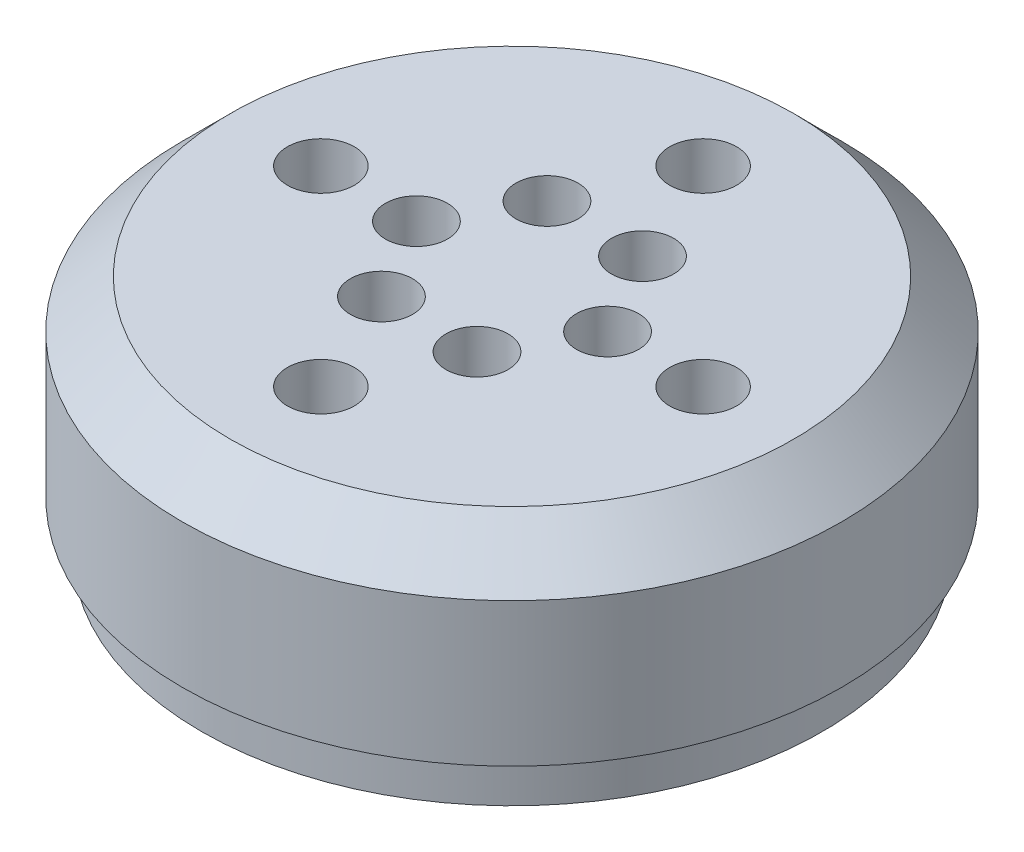
ISO-10303-21;
HEADER;
FILE_DESCRIPTION(('STEP AP214'),'2;1');
FILE_NAME('part.step','',(''),(''),'','','');
FILE_SCHEMA(('AUTOMOTIVE_DESIGN { 1 0 10303 214 1 1 1 1 }'));
ENDSEC;
DATA;
#1=APPLICATION_CONTEXT('core data for automotive mechanical design processes');
#2=APPLICATION_PROTOCOL_DEFINITION('international standard','automotive_design',2000,#1);
#3=PRODUCT_CONTEXT('',#1,'mechanical');
#4=PRODUCT('Part','Part','',(#3));
#5=PRODUCT_RELATED_PRODUCT_CATEGORY('part','',(#4));
#6=PRODUCT_DEFINITION_FORMATION('','',#4);
#7=PRODUCT_DEFINITION_CONTEXT('part definition',#1,'design');
#8=PRODUCT_DEFINITION('design','',#6,#7);
#9=PRODUCT_DEFINITION_SHAPE('','',#8);
#10=(LENGTH_UNIT() NAMED_UNIT(*) SI_UNIT(.MILLI.,.METRE.));
#11=(NAMED_UNIT(*) PLANE_ANGLE_UNIT() SI_UNIT($,.RADIAN.));
#12=(NAMED_UNIT(*) SI_UNIT($,.STERADIAN.) SOLID_ANGLE_UNIT());
#13=UNCERTAINTY_MEASURE_WITH_UNIT(LENGTH_MEASURE(1.E-05),#10,'distance_accuracy_value','');
#14=(GEOMETRIC_REPRESENTATION_CONTEXT(3) GLOBAL_UNCERTAINTY_ASSIGNED_CONTEXT((#13)) GLOBAL_UNIT_ASSIGNED_CONTEXT((#10,
#11,#12)) REPRESENTATION_CONTEXT('',''));
#15=CARTESIAN_POINT('',(0.,0.,0.));
#16=DIRECTION('',(0.,0.,1.));
#17=DIRECTION('',(1.,0.,0.));
#18=AXIS2_PLACEMENT_3D('',#15,#16,#17);
#19=CARTESIAN_POINT('',(-4.99999999999981,11.5,-8.66025403784503));
#20=DIRECTION('',(0.,-1.,0.));
#21=DIRECTION('',(0.,0.,-1.));
#22=AXIS2_PLACEMENT_3D('',#19,#20,#21);
#23=CYLINDRICAL_SURFACE('',#22,1.24999999999972);
#24=CARTESIAN_POINT('',(-4.99999999999981,0.,-8.66025403784503));
#25=DIRECTION('',(0.,1.,0.));
#26=DIRECTION('',(0.,0.,1.));
#27=AXIS2_PLACEMENT_3D('',#24,#25,#26);
#28=CIRCLE('',#27,1.24999999999972);
#29=CARTESIAN_POINT('',(-4.99999999999981,0.,-7.41025403784531));
#30=VERTEX_POINT('',#29);
#31=EDGE_CURVE('E102',#30,#30,#28,.T.);
#32=ORIENTED_EDGE('',*,*,#31,.F.);
#33=EDGE_LOOP('',(#32));
#34=FACE_BOUND('',#33,.T.);
#35=CARTESIAN_POINT('',(-4.99999999999981,4.,-8.66025403784503));
#36=DIRECTION('',(0.,1.,0.));
#37=DIRECTION('',(0.,0.,1.));
#38=AXIS2_PLACEMENT_3D('',#35,#36,#37);
#39=CIRCLE('',#38,1.24999999999972);
#40=CARTESIAN_POINT('',(-4.99999999999981,4.,-7.41025403784531));
#41=VERTEX_POINT('',#40);
#42=EDGE_CURVE('E69',#41,#41,#39,.T.);
#43=ORIENTED_EDGE('',*,*,#42,.T.);
#44=EDGE_LOOP('',(#43));
#45=FACE_BOUND('',#44,.T.);
#46=ADVANCED_FACE('F47',(#34,#45),#23,.F.);
#47=CARTESIAN_POINT('',(-9.99999999999999,11.5,-2.00360561475321E-13));
#48=DIRECTION('',(0.,-1.,0.));
#49=DIRECTION('',(0.,0.,-1.));
#50=AXIS2_PLACEMENT_3D('',#47,#48,#49);
#51=CYLINDRICAL_SURFACE('',#50,1.25);
#52=CARTESIAN_POINT('',(-9.99999999999999,0.,-2.00360561475321E-13));
#53=DIRECTION('',(0.,1.,0.));
#54=DIRECTION('',(0.,0.,1.));
#55=AXIS2_PLACEMENT_3D('',#52,#53,#54);
#56=CIRCLE('',#55,1.25);
#57=CARTESIAN_POINT('',(-9.99999999999999,0.,1.2499999999998));
#58=VERTEX_POINT('',#57);
#59=EDGE_CURVE('E73',#58,#58,#56,.T.);
#60=ORIENTED_EDGE('',*,*,#59,.F.);
#61=EDGE_LOOP('',(#60));
#62=FACE_BOUND('',#61,.T.);
#63=CARTESIAN_POINT('',(-9.99999999999999,4.,-2.00360561475321E-13));
#64=DIRECTION('',(0.,1.,0.));
#65=DIRECTION('',(0.,0.,1.));
#66=AXIS2_PLACEMENT_3D('',#63,#64,#65);
#67=CIRCLE('',#66,1.25);
#68=CARTESIAN_POINT('',(-9.99999999999999,4.,1.2499999999998));
#69=VERTEX_POINT('',#68);
#70=EDGE_CURVE('E74',#69,#69,#67,.T.);
#71=ORIENTED_EDGE('',*,*,#70,.T.);
#72=EDGE_LOOP('',(#71));
#73=FACE_BOUND('',#72,.T.);
#74=ADVANCED_FACE('F257',(#62,#73),#51,.F.);
#75=CARTESIAN_POINT('',(-4.99999999999968,11.5,8.66025403784456));
#76=DIRECTION('',(0.,-1.,0.));
#77=DIRECTION('',(0.,0.,-1.));
#78=AXIS2_PLACEMENT_3D('',#75,#76,#77);
#79=CYLINDRICAL_SURFACE('',#78,1.25000000000053);
#80=CARTESIAN_POINT('',(-4.99999999999968,0.,8.66025403784456));
#81=DIRECTION('',(0.,1.,0.));
#82=DIRECTION('',(0.,0.,1.));
#83=AXIS2_PLACEMENT_3D('',#80,#81,#82);
#84=CIRCLE('',#83,1.25000000000053);
#85=CARTESIAN_POINT('',(-4.99999999999968,0.,9.91025403784509));
#86=VERTEX_POINT('',#85);
#87=EDGE_CURVE('E123',#86,#86,#84,.T.);
#88=ORIENTED_EDGE('',*,*,#87,.F.);
#89=EDGE_LOOP('',(#88));
#90=FACE_BOUND('',#89,.T.);
#91=CARTESIAN_POINT('',(-4.99999999999968,4.,8.66025403784456));
#92=DIRECTION('',(0.,1.,0.));
#93=DIRECTION('',(0.,0.,1.));
#94=AXIS2_PLACEMENT_3D('',#91,#92,#93);
#95=CIRCLE('',#94,1.25000000000053);
#96=CARTESIAN_POINT('',(-4.99999999999968,4.,9.91025403784509));
#97=VERTEX_POINT('',#96);
#98=EDGE_CURVE('E78',#97,#97,#95,.T.);
#99=ORIENTED_EDGE('',*,*,#98,.T.);
#100=EDGE_LOOP('',(#99));
#101=FACE_BOUND('',#100,.T.);
#102=ADVANCED_FACE('F264',(#90,#101),#79,.F.);
#103=CARTESIAN_POINT('',(5.00000000000066,11.5,-8.6602540378451));
#104=DIRECTION('',(0.,-1.,0.));
#105=DIRECTION('',(0.,0.,-1.));
#106=AXIS2_PLACEMENT_3D('',#103,#104,#105);
#107=CYLINDRICAL_SURFACE('',#106,1.25000000000011);
#108=CARTESIAN_POINT('',(5.00000000000066,0.,-8.6602540378451));
#109=DIRECTION('',(0.,1.,0.));
#110=DIRECTION('',(0.,0.,1.));
#111=AXIS2_PLACEMENT_3D('',#108,#109,#110);
#112=CIRCLE('',#111,1.25000000000011);
#113=CARTESIAN_POINT('',(5.00000000000066,0.,-7.41025403784499));
#114=VERTEX_POINT('',#113);
#115=EDGE_CURVE('E107',#114,#114,#112,.T.);
#116=ORIENTED_EDGE('',*,*,#115,.F.);
#117=EDGE_LOOP('',(#116));
#118=FACE_BOUND('',#117,.T.);
#119=CARTESIAN_POINT('',(5.00000000000066,4.,-8.6602540378451));
#120=DIRECTION('',(0.,1.,0.));
#121=DIRECTION('',(0.,0.,1.));
#122=AXIS2_PLACEMENT_3D('',#119,#120,#121);
#123=CIRCLE('',#122,1.25000000000011);
#124=CARTESIAN_POINT('',(5.00000000000066,4.,-7.41025403784499));
#125=VERTEX_POINT('',#124);
#126=EDGE_CURVE('E82',#125,#125,#123,.T.);
#127=ORIENTED_EDGE('',*,*,#126,.T.);
#128=EDGE_LOOP('',(#127));
#129=FACE_BOUND('',#128,.T.);
#130=ADVANCED_FACE('F270',(#118,#129),#107,.F.);
#131=CARTESIAN_POINT('',(10.000000000001,11.5,-3.44968021723089E-13));
#132=DIRECTION('',(0.,-1.,0.));
#133=DIRECTION('',(0.,0.,-1.));
#134=AXIS2_PLACEMENT_3D('',#131,#132,#133);
#135=CYLINDRICAL_SURFACE('',#134,1.25000000000068);
#136=CARTESIAN_POINT('',(10.000000000001,0.,-3.44968021723089E-13));
#137=DIRECTION('',(0.,1.,0.));
#138=DIRECTION('',(0.,0.,1.));
#139=AXIS2_PLACEMENT_3D('',#136,#137,#138);
#140=CIRCLE('',#139,1.25000000000068);
#141=CARTESIAN_POINT('',(10.000000000001,0.,1.25000000000034));
#142=VERTEX_POINT('',#141);
#143=EDGE_CURVE('E112',#142,#142,#140,.T.);
#144=ORIENTED_EDGE('',*,*,#143,.F.);
#145=EDGE_LOOP('',(#144));
#146=FACE_BOUND('',#145,.T.);
#147=CARTESIAN_POINT('',(10.000000000001,4.,-3.44968021723089E-13));
#148=DIRECTION('',(0.,1.,0.));
#149=DIRECTION('',(0.,0.,1.));
#150=AXIS2_PLACEMENT_3D('',#147,#148,#149);
#151=CIRCLE('',#150,1.25000000000068);
#152=CARTESIAN_POINT('',(10.000000000001,4.,1.25000000000034));
#153=VERTEX_POINT('',#152);
#154=EDGE_CURVE('E86',#153,#153,#151,.T.);
#155=ORIENTED_EDGE('',*,*,#154,.T.);
#156=EDGE_LOOP('',(#155));
#157=FACE_BOUND('',#156,.T.);
#158=ADVANCED_FACE('F289',(#146,#157),#135,.F.);
#159=CARTESIAN_POINT('',(5.00000000000078,11.5,8.66025403784449));
#160=DIRECTION('',(0.,-1.,0.));
#161=DIRECTION('',(0.,0.,-1.));
#162=AXIS2_PLACEMENT_3D('',#159,#160,#161);
#163=CYLINDRICAL_SURFACE('',#162,1.25000000000087);
#164=CARTESIAN_POINT('',(5.00000000000078,0.,8.66025403784449));
#165=DIRECTION('',(0.,1.,0.));
#166=DIRECTION('',(0.,0.,1.));
#167=AXIS2_PLACEMENT_3D('',#164,#165,#166);
#168=CIRCLE('',#167,1.25000000000087);
#169=CARTESIAN_POINT('',(5.00000000000078,0.,9.91025403784536));
#170=VERTEX_POINT('',#169);
#171=EDGE_CURVE('E119',#170,#170,#168,.T.);
#172=ORIENTED_EDGE('',*,*,#171,.F.);
#173=EDGE_LOOP('',(#172));
#174=FACE_BOUND('',#173,.T.);
#175=CARTESIAN_POINT('',(5.00000000000078,4.,8.66025403784449));
#176=DIRECTION('',(0.,1.,0.));
#177=DIRECTION('',(0.,0.,1.));
#178=AXIS2_PLACEMENT_3D('',#175,#176,#177);
#179=CIRCLE('',#178,1.25000000000087);
#180=CARTESIAN_POINT('',(5.00000000000078,4.,9.91025403784536));
#181=VERTEX_POINT('',#180);
#182=EDGE_CURVE('E90',#181,#181,#179,.T.);
#183=ORIENTED_EDGE('',*,*,#182,.T.);
#184=EDGE_LOOP('',(#183));
#185=FACE_BOUND('',#184,.T.);
#186=ADVANCED_FACE('F284',(#174,#185),#163,.F.);
#187=CARTESIAN_POINT('',(0.,5.,0.));
#188=DIRECTION('',(0.,-1.,0.));
#189=DIRECTION('',(0.,0.,-1.));
#190=AXIS2_PLACEMENT_3D('',#187,#188,#189);
#191=CYLINDRICAL_SURFACE('',#190,32.5);
#192=CARTESIAN_POINT('',(0.,5.,0.));
#193=DIRECTION('',(0.,1.,0.));
#194=DIRECTION('',(0.,0.,1.));
#195=AXIS2_PLACEMENT_3D('',#192,#193,#194);
#196=CIRCLE('',#195,32.5);
#197=CARTESIAN_POINT('',(0.,5.,32.5));
#198=VERTEX_POINT('',#197);
#199=EDGE_CURVE('E61',#198,#198,#196,.T.);
#200=ORIENTED_EDGE('',*,*,#199,.F.);
#201=EDGE_LOOP('',(#200));
#202=FACE_BOUND('',#201,.T.);
#203=CARTESIAN_POINT('',(0.,0.,0.));
#204=DIRECTION('',(0.,1.,0.));
#205=DIRECTION('',(0.,0.,1.));
#206=AXIS2_PLACEMENT_3D('',#203,#204,#205);
#207=CIRCLE('',#206,32.5);
#208=CARTESIAN_POINT('',(0.,0.,32.5));
#209=VERTEX_POINT('',#208);
#210=EDGE_CURVE('E66',#209,#209,#207,.T.);
#211=ORIENTED_EDGE('',*,*,#210,.T.);
#212=EDGE_LOOP('',(#211));
#213=FACE_BOUND('',#212,.T.);
#214=ADVANCED_FACE('F281',(#202,#213),#191,.T.);
#215=CARTESIAN_POINT('',(0.,0.,0.));
#216=DIRECTION('',(0.,1.,0.));
#217=DIRECTION('',(0.,0.,1.));
#218=AXIS2_PLACEMENT_3D('',#215,#216,#217);
#219=PLANE('',#218);
#220=ORIENTED_EDGE('',*,*,#171,.T.);
#221=EDGE_LOOP('',(#220));
#222=FACE_BOUND('',#221,.T.);
#223=ORIENTED_EDGE('',*,*,#143,.T.);
#224=EDGE_LOOP('',(#223));
#225=FACE_BOUND('',#224,.T.);
#226=ORIENTED_EDGE('',*,*,#115,.T.);
#227=EDGE_LOOP('',(#226));
#228=FACE_BOUND('',#227,.T.);
#229=CARTESIAN_POINT('',(0.,0.,0.));
#230=DIRECTION('',(0.,1.,0.));
#231=DIRECTION('',(0.,0.,1.));
#232=AXIS2_PLACEMENT_3D('',#229,#230,#231);
#233=CIRCLE('',#232,4.);
#234=CARTESIAN_POINT('',(0.,0.,4.));
#235=VERTEX_POINT('',#234);
#236=EDGE_CURVE('E106',#235,#235,#233,.T.);
#237=ORIENTED_EDGE('',*,*,#236,.T.);
#238=EDGE_LOOP('',(#237));
#239=FACE_BOUND('',#238,.T.);
#240=ORIENTED_EDGE('',*,*,#87,.T.);
#241=EDGE_LOOP('',(#240));
#242=FACE_BOUND('',#241,.T.);
#243=ORIENTED_EDGE('',*,*,#59,.T.);
#244=EDGE_LOOP('',(#243));
#245=FACE_BOUND('',#244,.T.);
#246=ORIENTED_EDGE('',*,*,#31,.T.);
#247=EDGE_LOOP('',(#246));
#248=FACE_BOUND('',#247,.T.);
#249=ORIENTED_EDGE('',*,*,#210,.F.);
#250=EDGE_LOOP('',(#249));
#251=FACE_BOUND('',#250,.T.);
#252=ADVANCED_FACE('F279',(#222,#225,#228,#239,#242,#245,#248,#251),#219,.F.);
#253=CARTESIAN_POINT('',(0.,25.,0.));
#254=DIRECTION('',(0.,-1.,0.));
#255=DIRECTION('',(0.,0.,-1.));
#256=AXIS2_PLACEMENT_3D('',#253,#254,#255);
#257=CYLINDRICAL_SURFACE('',#256,34.5);
#258=CARTESIAN_POINT('',(0.,20.,0.));
#259=DIRECTION('',(0.,1.,0.));
#260=DIRECTION('',(0.,0.,1.));
#261=AXIS2_PLACEMENT_3D('',#258,#259,#260);
#262=CIRCLE('',#261,34.5);
#263=CARTESIAN_POINT('',(0.,20.,34.5));
#264=VERTEX_POINT('',#263);
#265=EDGE_CURVE('E11',#264,#264,#262,.F.);
#266=ORIENTED_EDGE('',*,*,#265,.T.);
#267=EDGE_LOOP('',(#266));
#268=FACE_BOUND('',#267,.T.);
#269=CARTESIAN_POINT('',(0.,5.,0.));
#270=DIRECTION('',(0.,1.,0.));
#271=DIRECTION('',(0.,0.,1.));
#272=AXIS2_PLACEMENT_3D('',#269,#270,#271);
#273=CIRCLE('',#272,34.5);
#274=CARTESIAN_POINT('',(0.,5.,34.5));
#275=VERTEX_POINT('',#274);
#276=EDGE_CURVE('E97',#275,#275,#273,.T.);
#277=ORIENTED_EDGE('',*,*,#276,.T.);
#278=EDGE_LOOP('',(#277));
#279=FACE_BOUND('',#278,.T.);
#280=ADVANCED_FACE('F219',(#268,#279),#257,.T.);
#281=CARTESIAN_POINT('',(0.,25.,0.));
#282=DIRECTION('',(0.,1.,0.));
#283=DIRECTION('',(0.,0.,1.));
#284=AXIS2_PLACEMENT_3D('',#281,#282,#283);
#285=PLANE('',#284);
#286=CARTESIAN_POINT('',(0.,25.,0.));
#287=DIRECTION('',(0.,1.,0.));
#288=DIRECTION('',(0.,0.,1.));
#289=AXIS2_PLACEMENT_3D('',#286,#287,#288);
#290=CIRCLE('',#289,29.5);
#291=CARTESIAN_POINT('',(0.,25.,29.5));
#292=VERTEX_POINT('',#291);
#293=EDGE_CURVE('E56',#292,#292,#290,.T.);
#294=ORIENTED_EDGE('',*,*,#293,.T.);
#295=EDGE_LOOP('',(#294));
#296=FACE_BOUND('',#295,.T.);
#297=CARTESIAN_POINT('',(0.,25.,-20.));
#298=DIRECTION('',(0.,1.,0.));
#299=DIRECTION('',(0.,0.,1.));
#300=AXIS2_PLACEMENT_3D('',#297,#298,#299);
#301=CIRCLE('',#300,3.5);
#302=CARTESIAN_POINT('',(0.,25.,-16.5));
#303=VERTEX_POINT('',#302);
#304=EDGE_CURVE('E202',#303,#303,#301,.T.);
#305=ORIENTED_EDGE('',*,*,#304,.F.);
#306=EDGE_LOOP('',(#305));
#307=FACE_BOUND('',#306,.T.);
#308=CARTESIAN_POINT('',(20.,25.,0.));
#309=DIRECTION('',(0.,1.,0.));
#310=DIRECTION('',(0.,0.,1.));
#311=AXIS2_PLACEMENT_3D('',#308,#309,#310);
#312=CIRCLE('',#311,3.5);
#313=CARTESIAN_POINT('',(20.,25.,3.5));
#314=VERTEX_POINT('',#313);
#315=EDGE_CURVE('E198',#314,#314,#312,.T.);
#316=ORIENTED_EDGE('',*,*,#315,.F.);
#317=EDGE_LOOP('',(#316));
#318=FACE_BOUND('',#317,.T.);
#319=CARTESIAN_POINT('',(0.,25.,20.));
#320=DIRECTION('',(0.,1.,0.));
#321=DIRECTION('',(0.,0.,1.));
#322=AXIS2_PLACEMENT_3D('',#319,#320,#321);
#323=CIRCLE('',#322,3.5);
#324=CARTESIAN_POINT('',(0.,25.,23.5));
#325=VERTEX_POINT('',#324);
#326=EDGE_CURVE('E190',#325,#325,#323,.T.);
#327=ORIENTED_EDGE('',*,*,#326,.F.);
#328=EDGE_LOOP('',(#327));
#329=FACE_BOUND('',#328,.T.);
#330=CARTESIAN_POINT('',(-20.,25.,0.));
#331=DIRECTION('',(0.,1.,0.));
#332=DIRECTION('',(0.,0.,1.));
#333=AXIS2_PLACEMENT_3D('',#330,#331,#332);
#334=CIRCLE('',#333,3.5);
#335=CARTESIAN_POINT('',(-20.,25.,3.5));
#336=VERTEX_POINT('',#335);
#337=EDGE_CURVE('E181',#336,#336,#334,.T.);
#338=ORIENTED_EDGE('',*,*,#337,.F.);
#339=EDGE_LOOP('',(#338));
#340=FACE_BOUND('',#339,.T.);
#341=CARTESIAN_POINT('',(5.00000000000066,25.,-8.6602540378451));
#342=DIRECTION('',(0.,1.,0.));
#343=DIRECTION('',(0.,0.,1.));
#344=AXIS2_PLACEMENT_3D('',#341,#342,#343);
#345=CIRCLE('',#344,3.25);
#346=CARTESIAN_POINT('',(5.00000000000066,25.,-5.4102540378451));
#347=VERTEX_POINT('',#346);
#348=EDGE_CURVE('E140',#347,#347,#345,.T.);
#349=ORIENTED_EDGE('',*,*,#348,.F.);
#350=EDGE_LOOP('',(#349));
#351=FACE_BOUND('',#350,.T.);
#352=CARTESIAN_POINT('',(5.00000000000025,25.,8.66025403784534));
#353=DIRECTION('',(0.,1.,0.));
#354=DIRECTION('',(0.,0.,1.));
#355=AXIS2_PLACEMENT_3D('',#352,#353,#354);
#356=CIRCLE('',#355,3.25);
#357=CARTESIAN_POINT('',(5.00000000000025,25.,11.9102540378453));
#358=VERTEX_POINT('',#357);
#359=EDGE_CURVE('E159',#358,#358,#356,.T.);
#360=ORIENTED_EDGE('',*,*,#359,.F.);
#361=EDGE_LOOP('',(#360));
#362=FACE_BOUND('',#361,.T.);
#363=CARTESIAN_POINT('',(-5.00000000000072,25.,8.66025403784507));
#364=DIRECTION('',(0.,1.,0.));
#365=DIRECTION('',(0.,0.,1.));
#366=AXIS2_PLACEMENT_3D('',#363,#364,#365);
#367=CIRCLE('',#366,3.25);
#368=CARTESIAN_POINT('',(-5.00000000000072,25.,11.9102540378451));
#369=VERTEX_POINT('',#368);
#370=EDGE_CURVE('E151',#369,#369,#367,.T.);
#371=ORIENTED_EDGE('',*,*,#370,.F.);
#372=EDGE_LOOP('',(#371));
#373=FACE_BOUND('',#372,.T.);
#374=CARTESIAN_POINT('',(-10.0000000000009,25.,-3.03576608295941E-13));
#375=DIRECTION('',(0.,1.,0.));
#376=DIRECTION('',(0.,0.,1.));
#377=AXIS2_PLACEMENT_3D('',#374,#375,#376);
#378=CIRCLE('',#377,3.25);
#379=CARTESIAN_POINT('',(-10.0000000000009,25.,3.2499999999997));
#380=VERTEX_POINT('',#379);
#381=EDGE_CURVE('E141',#380,#380,#378,.T.);
#382=ORIENTED_EDGE('',*,*,#381,.F.);
#383=EDGE_LOOP('',(#382));
#384=FACE_BOUND('',#383,.T.);
#385=CARTESIAN_POINT('',(-5.00000000000019,25.,-8.66025403784537));
#386=DIRECTION('',(0.,1.,0.));
#387=DIRECTION('',(0.,0.,1.));
#388=AXIS2_PLACEMENT_3D('',#385,#386,#387);
#389=CIRCLE('',#388,3.25);
#390=CARTESIAN_POINT('',(-5.00000000000019,25.,-5.41025403784537));
#391=VERTEX_POINT('',#390);
#392=EDGE_CURVE('E150',#391,#391,#389,.T.);
#393=ORIENTED_EDGE('',*,*,#392,.F.);
#394=EDGE_LOOP('',(#393));
#395=FACE_BOUND('',#394,.T.);
#396=CARTESIAN_POINT('',(10.0000000000009,25.,2.34187669256869E-13));
#397=DIRECTION('',(0.,1.,0.));
#398=DIRECTION('',(0.,0.,1.));
#399=AXIS2_PLACEMENT_3D('',#396,#397,#398);
#400=CIRCLE('',#399,3.25);
#401=CARTESIAN_POINT('',(10.0000000000009,25.,3.25000000000023));
#402=VERTEX_POINT('',#401);
#403=EDGE_CURVE('E136',#402,#402,#400,.T.);
#404=ORIENTED_EDGE('',*,*,#403,.F.);
#405=EDGE_LOOP('',(#404));
#406=FACE_BOUND('',#405,.T.);
#407=ADVANCED_FACE('F215',(#296,#307,#318,#329,#340,#351,#362,#373,#384,#395,#406),#285,.T.);
#408=CARTESIAN_POINT('',(0.,5.,0.));
#409=DIRECTION('',(0.,1.,0.));
#410=DIRECTION('',(0.,0.,1.));
#411=AXIS2_PLACEMENT_3D('',#408,#409,#410);
#412=PLANE('',#411);
#413=ORIENTED_EDGE('',*,*,#199,.T.);
#414=EDGE_LOOP('',(#413));
#415=FACE_BOUND('',#414,.T.);
#416=ORIENTED_EDGE('',*,*,#276,.F.);
#417=EDGE_LOOP('',(#416));
#418=FACE_BOUND('',#417,.T.);
#419=ADVANCED_FACE('F218',(#415,#418),#412,.F.);
#420=CARTESIAN_POINT('',(0.,11.5,0.));
#421=DIRECTION('',(0.,-1.,0.));
#422=DIRECTION('',(0.,0.,-1.));
#423=AXIS2_PLACEMENT_3D('',#420,#421,#422);
#424=CYLINDRICAL_SURFACE('',#423,4.);
#425=CARTESIAN_POINT('',(0.,11.5,0.));
#426=DIRECTION('',(0.,1.,0.));
#427=DIRECTION('',(0.,0.,1.));
#428=AXIS2_PLACEMENT_3D('',#425,#426,#427);
#429=CIRCLE('',#428,4.);
#430=CARTESIAN_POINT('',(0.,11.5,4.));
#431=VERTEX_POINT('',#430);
#432=EDGE_CURVE('E111',#431,#431,#429,.T.);
#433=ORIENTED_EDGE('',*,*,#432,.T.);
#434=EDGE_LOOP('',(#433));
#435=FACE_BOUND('',#434,.T.);
#436=ORIENTED_EDGE('',*,*,#236,.F.);
#437=EDGE_LOOP('',(#436));
#438=FACE_BOUND('',#437,.T.);
#439=ADVANCED_FACE('F275',(#435,#438),#424,.F.);
#440=CARTESIAN_POINT('',(0.,11.5,0.));
#441=DIRECTION('',(0.,1.,0.));
#442=DIRECTION('',(0.,0.,1.));
#443=AXIS2_PLACEMENT_3D('',#440,#441,#442);
#444=PLANE('',#443);
#445=ORIENTED_EDGE('',*,*,#432,.F.);
#446=EDGE_LOOP('',(#445));
#447=FACE_BOUND('',#446,.T.);
#448=ADVANCED_FACE('F309',(#447),#444,.F.);
#449=CARTESIAN_POINT('',(5.00000000000025,-9.19238815542512,8.66025403784534));
#450=DIRECTION('',(0.,1.,0.));
#451=DIRECTION('',(0.,0.,1.));
#452=AXIS2_PLACEMENT_3D('',#449,#450,#451);
#453=CYLINDRICAL_SURFACE('',#452,3.25);
#454=CARTESIAN_POINT('',(5.00000000000025,4.,8.66025403784534));
#455=DIRECTION('',(0.,1.,0.));
#456=DIRECTION('',(0.,0.,1.));
#457=AXIS2_PLACEMENT_3D('',#454,#455,#456);
#458=CIRCLE('',#457,3.25);
#459=CARTESIAN_POINT('',(5.00000000000025,4.,11.9102540378453));
#460=VERTEX_POINT('',#459);
#461=EDGE_CURVE('E155',#460,#460,#458,.F.);
#462=ORIENTED_EDGE('',*,*,#461,.T.);
#463=EDGE_LOOP('',(#462));
#464=FACE_BOUND('',#463,.T.);
#465=ORIENTED_EDGE('',*,*,#359,.T.);
#466=EDGE_LOOP('',(#465));
#467=FACE_BOUND('',#466,.T.);
#468=ADVANCED_FACE('F252',(#464,#467),#453,.F.);
#469=CARTESIAN_POINT('',(0.,4.,0.));
#470=DIRECTION('',(0.,1.,0.));
#471=DIRECTION('',(0.,0.,1.));
#472=AXIS2_PLACEMENT_3D('',#469,#470,#471);
#473=PLANE('',#472);
#474=ORIENTED_EDGE('',*,*,#182,.F.);
#475=EDGE_LOOP('',(#474));
#476=FACE_BOUND('',#475,.T.);
#477=ORIENTED_EDGE('',*,*,#461,.F.);
#478=EDGE_LOOP('',(#477));
#479=FACE_BOUND('',#478,.T.);
#480=ADVANCED_FACE('F242',(#476,#479),#473,.T.);
#481=CARTESIAN_POINT('',(10.0000000000009,-9.19238815542512,2.34187669256869E-13));
#482=DIRECTION('',(0.,1.,0.));
#483=DIRECTION('',(0.,0.,1.));
#484=AXIS2_PLACEMENT_3D('',#481,#482,#483);
#485=CYLINDRICAL_SURFACE('',#484,3.25);
#486=CARTESIAN_POINT('',(10.0000000000009,4.,2.34187669256869E-13));
#487=DIRECTION('',(0.,1.,0.));
#488=DIRECTION('',(0.,0.,1.));
#489=AXIS2_PLACEMENT_3D('',#486,#487,#488);
#490=CIRCLE('',#489,3.25);
#491=CARTESIAN_POINT('',(10.0000000000009,4.,3.25000000000023));
#492=VERTEX_POINT('',#491);
#493=EDGE_CURVE('E94',#492,#492,#490,.F.);
#494=ORIENTED_EDGE('',*,*,#493,.T.);
#495=EDGE_LOOP('',(#494));
#496=FACE_BOUND('',#495,.T.);
#497=ORIENTED_EDGE('',*,*,#403,.T.);
#498=EDGE_LOOP('',(#497));
#499=FACE_BOUND('',#498,.T.);
#500=ADVANCED_FACE('F239',(#496,#499),#485,.F.);
#501=CARTESIAN_POINT('',(0.,4.,0.));
#502=DIRECTION('',(0.,1.,0.));
#503=DIRECTION('',(0.,0.,1.));
#504=AXIS2_PLACEMENT_3D('',#501,#502,#503);
#505=PLANE('',#504);
#506=ORIENTED_EDGE('',*,*,#154,.F.);
#507=EDGE_LOOP('',(#506));
#508=FACE_BOUND('',#507,.T.);
#509=ORIENTED_EDGE('',*,*,#493,.F.);
#510=EDGE_LOOP('',(#509));
#511=FACE_BOUND('',#510,.T.);
#512=ADVANCED_FACE('F241',(#508,#511),#505,.T.);
#513=CARTESIAN_POINT('',(5.00000000000066,-9.19238815542512,-8.6602540378451));
#514=DIRECTION('',(0.,1.,0.));
#515=DIRECTION('',(0.,0.,1.));
#516=AXIS2_PLACEMENT_3D('',#513,#514,#515);
#517=CYLINDRICAL_SURFACE('',#516,3.25);
#518=CARTESIAN_POINT('',(5.00000000000066,4.,-8.6602540378451));
#519=DIRECTION('',(0.,1.,0.));
#520=DIRECTION('',(0.,0.,1.));
#521=AXIS2_PLACEMENT_3D('',#518,#519,#520);
#522=CIRCLE('',#521,3.25);
#523=CARTESIAN_POINT('',(5.00000000000066,4.,-5.4102540378451));
#524=VERTEX_POINT('',#523);
#525=EDGE_CURVE('E163',#524,#524,#522,.F.);
#526=ORIENTED_EDGE('',*,*,#525,.T.);
#527=EDGE_LOOP('',(#526));
#528=FACE_BOUND('',#527,.T.);
#529=ORIENTED_EDGE('',*,*,#348,.T.);
#530=EDGE_LOOP('',(#529));
#531=FACE_BOUND('',#530,.T.);
#532=ADVANCED_FACE('F249',(#528,#531),#517,.F.);
#533=CARTESIAN_POINT('',(0.,4.,0.));
#534=DIRECTION('',(0.,1.,0.));
#535=DIRECTION('',(0.,0.,1.));
#536=AXIS2_PLACEMENT_3D('',#533,#534,#535);
#537=PLANE('',#536);
#538=ORIENTED_EDGE('',*,*,#126,.F.);
#539=EDGE_LOOP('',(#538));
#540=FACE_BOUND('',#539,.T.);
#541=ORIENTED_EDGE('',*,*,#525,.F.);
#542=EDGE_LOOP('',(#541));
#543=FACE_BOUND('',#542,.T.);
#544=ADVANCED_FACE('F348',(#540,#543),#537,.T.);
#545=CARTESIAN_POINT('',(-5.00000000000072,-9.19238815542512,8.66025403784507));
#546=DIRECTION('',(0.,1.,0.));
#547=DIRECTION('',(0.,0.,1.));
#548=AXIS2_PLACEMENT_3D('',#545,#546,#547);
#549=CYLINDRICAL_SURFACE('',#548,3.25);
#550=CARTESIAN_POINT('',(-5.00000000000072,4.,8.66025403784507));
#551=DIRECTION('',(0.,1.,0.));
#552=DIRECTION('',(0.,0.,1.));
#553=AXIS2_PLACEMENT_3D('',#550,#551,#552);
#554=CIRCLE('',#553,3.25);
#555=CARTESIAN_POINT('',(-5.00000000000072,4.,11.9102540378451));
#556=VERTEX_POINT('',#555);
#557=EDGE_CURVE('E145',#556,#556,#554,.F.);
#558=ORIENTED_EDGE('',*,*,#557,.T.);
#559=EDGE_LOOP('',(#558));
#560=FACE_BOUND('',#559,.T.);
#561=ORIENTED_EDGE('',*,*,#370,.T.);
#562=EDGE_LOOP('',(#561));
#563=FACE_BOUND('',#562,.T.);
#564=ADVANCED_FACE('F343',(#560,#563),#549,.F.);
#565=CARTESIAN_POINT('',(0.,4.,0.));
#566=DIRECTION('',(0.,1.,0.));
#567=DIRECTION('',(0.,0.,1.));
#568=AXIS2_PLACEMENT_3D('',#565,#566,#567);
#569=PLANE('',#568);
#570=ORIENTED_EDGE('',*,*,#98,.F.);
#571=EDGE_LOOP('',(#570));
#572=FACE_BOUND('',#571,.T.);
#573=ORIENTED_EDGE('',*,*,#557,.F.);
#574=EDGE_LOOP('',(#573));
#575=FACE_BOUND('',#574,.T.);
#576=ADVANCED_FACE('F338',(#572,#575),#569,.T.);
#577=CARTESIAN_POINT('',(-10.0000000000009,-9.19238815542512,-3.03576608295941E-13));
#578=DIRECTION('',(0.,1.,0.));
#579=DIRECTION('',(0.,0.,1.));
#580=AXIS2_PLACEMENT_3D('',#577,#578,#579);
#581=CYLINDRICAL_SURFACE('',#580,3.25);
#582=CARTESIAN_POINT('',(-10.0000000000009,4.,-3.03576608295941E-13));
#583=DIRECTION('',(0.,1.,0.));
#584=DIRECTION('',(0.,0.,1.));
#585=AXIS2_PLACEMENT_3D('',#582,#583,#584);
#586=CIRCLE('',#585,3.25);
#587=CARTESIAN_POINT('',(-10.0000000000009,4.,3.2499999999997));
#588=VERTEX_POINT('',#587);
#589=EDGE_CURVE('E146',#588,#588,#586,.F.);
#590=ORIENTED_EDGE('',*,*,#589,.T.);
#591=EDGE_LOOP('',(#590));
#592=FACE_BOUND('',#591,.T.);
#593=ORIENTED_EDGE('',*,*,#381,.T.);
#594=EDGE_LOOP('',(#593));
#595=FACE_BOUND('',#594,.T.);
#596=ADVANCED_FACE('F332',(#592,#595),#581,.F.);
#597=CARTESIAN_POINT('',(0.,4.,0.));
#598=DIRECTION('',(0.,1.,0.));
#599=DIRECTION('',(0.,0.,1.));
#600=AXIS2_PLACEMENT_3D('',#597,#598,#599);
#601=PLANE('',#600);
#602=ORIENTED_EDGE('',*,*,#70,.F.);
#603=EDGE_LOOP('',(#602));
#604=FACE_BOUND('',#603,.T.);
#605=ORIENTED_EDGE('',*,*,#589,.F.);
#606=EDGE_LOOP('',(#605));
#607=FACE_BOUND('',#606,.T.);
#608=ADVANCED_FACE('F328',(#604,#607),#601,.T.);
#609=CARTESIAN_POINT('',(-5.00000000000019,-9.19238815542512,-8.66025403784537));
#610=DIRECTION('',(0.,1.,0.));
#611=DIRECTION('',(0.,0.,1.));
#612=AXIS2_PLACEMENT_3D('',#609,#610,#611);
#613=CYLINDRICAL_SURFACE('',#612,3.25);
#614=CARTESIAN_POINT('',(-5.00000000000019,4.,-8.66025403784537));
#615=DIRECTION('',(0.,1.,0.));
#616=DIRECTION('',(0.,0.,1.));
#617=AXIS2_PLACEMENT_3D('',#614,#615,#616);
#618=CIRCLE('',#617,3.25);
#619=CARTESIAN_POINT('',(-5.00000000000019,4.,-5.41025403784537));
#620=VERTEX_POINT('',#619);
#621=EDGE_CURVE('E176',#620,#620,#618,.F.);
#622=ORIENTED_EDGE('',*,*,#621,.T.);
#623=EDGE_LOOP('',(#622));
#624=FACE_BOUND('',#623,.T.);
#625=ORIENTED_EDGE('',*,*,#392,.T.);
#626=EDGE_LOOP('',(#625));
#627=FACE_BOUND('',#626,.T.);
#628=ADVANCED_FACE('F331',(#624,#627),#613,.F.);
#629=CARTESIAN_POINT('',(0.,4.,0.));
#630=DIRECTION('',(0.,1.,0.));
#631=DIRECTION('',(0.,0.,1.));
#632=AXIS2_PLACEMENT_3D('',#629,#630,#631);
#633=PLANE('',#632);
#634=ORIENTED_EDGE('',*,*,#42,.F.);
#635=EDGE_LOOP('',(#634));
#636=FACE_BOUND('',#635,.T.);
#637=ORIENTED_EDGE('',*,*,#621,.F.);
#638=EDGE_LOOP('',(#637));
#639=FACE_BOUND('',#638,.T.);
#640=ADVANCED_FACE('F357',(#636,#639),#633,.T.);
#641=CARTESIAN_POINT('',(-20.,-9.89949493661167,0.));
#642=DIRECTION('',(0.,1.,0.));
#643=DIRECTION('',(0.,0.,1.));
#644=AXIS2_PLACEMENT_3D('',#641,#642,#643);
#645=CYLINDRICAL_SURFACE('',#644,3.5);
#646=CARTESIAN_POINT('',(-20.,3.5,0.));
#647=DIRECTION('',(0.,1.,0.));
#648=DIRECTION('',(0.,0.,1.));
#649=AXIS2_PLACEMENT_3D('',#646,#647,#648);
#650=CIRCLE('',#649,3.5);
#651=CARTESIAN_POINT('',(-20.,3.5,3.5));
#652=VERTEX_POINT('',#651);
#653=EDGE_CURVE('E186',#652,#652,#650,.F.);
#654=ORIENTED_EDGE('',*,*,#653,.T.);
#655=EDGE_LOOP('',(#654));
#656=FACE_BOUND('',#655,.T.);
#657=ORIENTED_EDGE('',*,*,#337,.T.);
#658=EDGE_LOOP('',(#657));
#659=FACE_BOUND('',#658,.T.);
#660=ADVANCED_FACE('F360',(#656,#659),#645,.F.);
#661=CARTESIAN_POINT('',(0.,3.5,0.));
#662=DIRECTION('',(0.,1.,0.));
#663=DIRECTION('',(0.,0.,1.));
#664=AXIS2_PLACEMENT_3D('',#661,#662,#663);
#665=PLANE('',#664);
#666=ORIENTED_EDGE('',*,*,#653,.F.);
#667=EDGE_LOOP('',(#666));
#668=FACE_BOUND('',#667,.T.);
#669=ADVANCED_FACE('F365',(#668),#665,.T.);
#670=CARTESIAN_POINT('',(0.,-9.89949493661167,20.));
#671=DIRECTION('',(0.,1.,0.));
#672=DIRECTION('',(0.,0.,1.));
#673=AXIS2_PLACEMENT_3D('',#670,#671,#672);
#674=CYLINDRICAL_SURFACE('',#673,3.5);
#675=CARTESIAN_POINT('',(0.,3.5,20.));
#676=DIRECTION('',(0.,1.,0.));
#677=DIRECTION('',(0.,0.,1.));
#678=AXIS2_PLACEMENT_3D('',#675,#676,#677);
#679=CIRCLE('',#678,3.5);
#680=CARTESIAN_POINT('',(0.,3.5,23.5));
#681=VERTEX_POINT('',#680);
#682=EDGE_CURVE('E185',#681,#681,#679,.F.);
#683=ORIENTED_EDGE('',*,*,#682,.T.);
#684=EDGE_LOOP('',(#683));
#685=FACE_BOUND('',#684,.T.);
#686=ORIENTED_EDGE('',*,*,#326,.T.);
#687=EDGE_LOOP('',(#686));
#688=FACE_BOUND('',#687,.T.);
#689=ADVANCED_FACE('F368',(#685,#688),#674,.F.);
#690=CARTESIAN_POINT('',(0.,3.5,0.));
#691=DIRECTION('',(0.,1.,0.));
#692=DIRECTION('',(0.,0.,1.));
#693=AXIS2_PLACEMENT_3D('',#690,#691,#692);
#694=PLANE('',#693);
#695=ORIENTED_EDGE('',*,*,#682,.F.);
#696=EDGE_LOOP('',(#695));
#697=FACE_BOUND('',#696,.T.);
#698=ADVANCED_FACE('F373',(#697),#694,.T.);
#699=CARTESIAN_POINT('',(20.,-9.89949493661167,0.));
#700=DIRECTION('',(0.,1.,0.));
#701=DIRECTION('',(0.,0.,1.));
#702=AXIS2_PLACEMENT_3D('',#699,#700,#701);
#703=CYLINDRICAL_SURFACE('',#702,3.5);
#704=CARTESIAN_POINT('',(20.,3.5,0.));
#705=DIRECTION('',(0.,1.,0.));
#706=DIRECTION('',(0.,0.,1.));
#707=AXIS2_PLACEMENT_3D('',#704,#705,#706);
#708=CIRCLE('',#707,3.5);
#709=CARTESIAN_POINT('',(20.,3.5,3.5));
#710=VERTEX_POINT('',#709);
#711=EDGE_CURVE('E194',#710,#710,#708,.F.);
#712=ORIENTED_EDGE('',*,*,#711,.T.);
#713=EDGE_LOOP('',(#712));
#714=FACE_BOUND('',#713,.T.);
#715=ORIENTED_EDGE('',*,*,#315,.T.);
#716=EDGE_LOOP('',(#715));
#717=FACE_BOUND('',#716,.T.);
#718=ADVANCED_FACE('F376',(#714,#717),#703,.F.);
#719=CARTESIAN_POINT('',(0.,3.5,0.));
#720=DIRECTION('',(0.,1.,0.));
#721=DIRECTION('',(0.,0.,1.));
#722=AXIS2_PLACEMENT_3D('',#719,#720,#721);
#723=PLANE('',#722);
#724=ORIENTED_EDGE('',*,*,#711,.F.);
#725=EDGE_LOOP('',(#724));
#726=FACE_BOUND('',#725,.T.);
#727=ADVANCED_FACE('F381',(#726),#723,.T.);
#728=CARTESIAN_POINT('',(0.,-9.89949493661167,-20.));
#729=DIRECTION('',(0.,1.,0.));
#730=DIRECTION('',(0.,0.,1.));
#731=AXIS2_PLACEMENT_3D('',#728,#729,#730);
#732=CYLINDRICAL_SURFACE('',#731,3.5);
#733=CARTESIAN_POINT('',(0.,3.5,-20.));
#734=DIRECTION('',(0.,1.,0.));
#735=DIRECTION('',(0.,0.,1.));
#736=AXIS2_PLACEMENT_3D('',#733,#734,#735);
#737=CIRCLE('',#736,3.5);
#738=CARTESIAN_POINT('',(0.,3.5,-16.5));
#739=VERTEX_POINT('',#738);
#740=EDGE_CURVE('E180',#739,#739,#737,.F.);
#741=ORIENTED_EDGE('',*,*,#740,.T.);
#742=EDGE_LOOP('',(#741));
#743=FACE_BOUND('',#742,.T.);
#744=ORIENTED_EDGE('',*,*,#304,.T.);
#745=EDGE_LOOP('',(#744));
#746=FACE_BOUND('',#745,.T.);
#747=ADVANCED_FACE('F213',(#743,#746),#732,.F.);
#748=CARTESIAN_POINT('',(0.,3.5,0.));
#749=DIRECTION('',(0.,1.,0.));
#750=DIRECTION('',(0.,0.,1.));
#751=AXIS2_PLACEMENT_3D('',#748,#749,#750);
#752=PLANE('',#751);
#753=ORIENTED_EDGE('',*,*,#740,.F.);
#754=EDGE_LOOP('',(#753));
#755=FACE_BOUND('',#754,.T.);
#756=ADVANCED_FACE('F390',(#755),#752,.T.);
#757=CARTESIAN_POINT('',(0.,25.,0.));
#758=DIRECTION('',(0.,-1.,0.));
#759=DIRECTION('',(0.,0.,-1.));
#760=AXIS2_PLACEMENT_3D('',#757,#758,#759);
#761=CONICAL_SURFACE('',#760,29.5,0.785398163397445);
#762=ORIENTED_EDGE('',*,*,#265,.F.);
#763=EDGE_LOOP('',(#762));
#764=FACE_BOUND('',#763,.T.);
#765=ORIENTED_EDGE('',*,*,#293,.F.);
#766=EDGE_LOOP('',(#765));
#767=FACE_BOUND('',#766,.T.);
#768=ADVANCED_FACE('F50',(#764,#767),#761,.T.);
#769=CLOSED_SHELL('',(#46,#74,#102,#130,#158,#186,#214,#252,#280,#407,#419,#439,#448,#468,#480,
#500,#512,#532,#544,#564,#576,#596,#608,#628,#640,#660,#669,#689,#698,#718,#727,#747,#756,#768));
#770=MANIFOLD_SOLID_BREP('B2',#769);
#771=ADVANCED_BREP_SHAPE_REPRESENTATION('',(#18,#770),#14);
#772=SHAPE_DEFINITION_REPRESENTATION(#9,#771);
ENDSEC;
END-ISO-10303-21;
